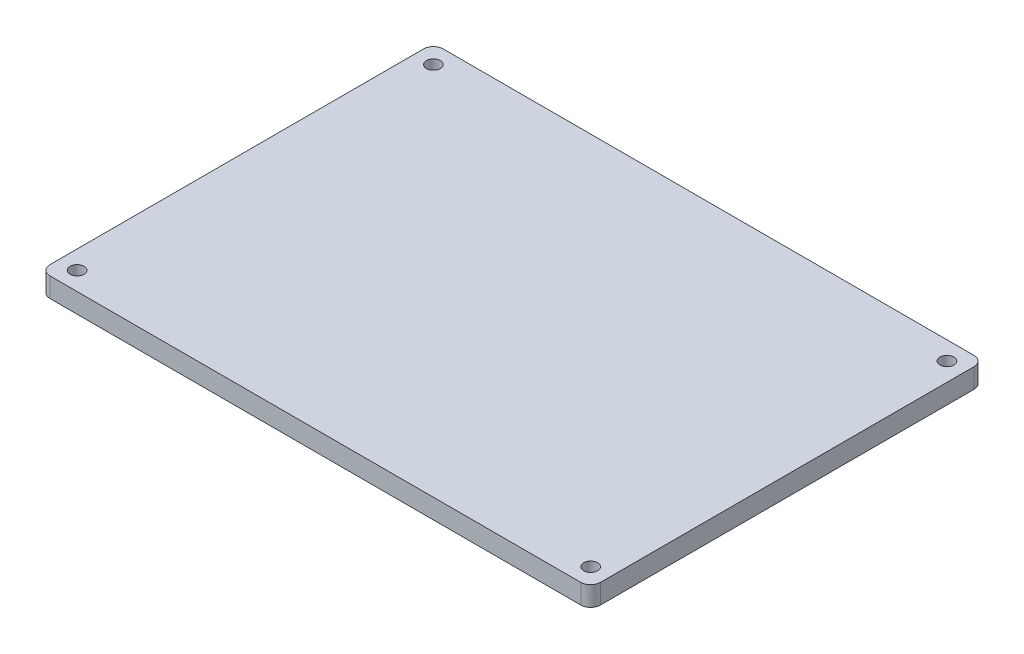
ISO-10303-21;
HEADER;
FILE_DESCRIPTION(('STEP AP214'),'2;1');
FILE_NAME('part.step','',(''),(''),'','','');
FILE_SCHEMA(('AUTOMOTIVE_DESIGN { 1 0 10303 214 1 1 1 1 }'));
ENDSEC;
DATA;
#1=APPLICATION_CONTEXT('core data for automotive mechanical design processes');
#2=APPLICATION_PROTOCOL_DEFINITION('international standard','automotive_design',2000,#1);
#3=PRODUCT_CONTEXT('',#1,'mechanical');
#4=PRODUCT('Part','Part','',(#3));
#5=PRODUCT_RELATED_PRODUCT_CATEGORY('part','',(#4));
#6=PRODUCT_DEFINITION_FORMATION('','',#4);
#7=PRODUCT_DEFINITION_CONTEXT('part definition',#1,'design');
#8=PRODUCT_DEFINITION('design','',#6,#7);
#9=PRODUCT_DEFINITION_SHAPE('','',#8);
#10=(LENGTH_UNIT() NAMED_UNIT(*) SI_UNIT(.MILLI.,.METRE.));
#11=(NAMED_UNIT(*) PLANE_ANGLE_UNIT() SI_UNIT($,.RADIAN.));
#12=(NAMED_UNIT(*) SI_UNIT($,.STERADIAN.) SOLID_ANGLE_UNIT());
#13=UNCERTAINTY_MEASURE_WITH_UNIT(LENGTH_MEASURE(1.E-05),#10,'distance_accuracy_value','');
#14=(GEOMETRIC_REPRESENTATION_CONTEXT(3) GLOBAL_UNCERTAINTY_ASSIGNED_CONTEXT((#13)) GLOBAL_UNIT_ASSIGNED_CONTEXT((#10,
#11,#12)) REPRESENTATION_CONTEXT('',''));
#15=CARTESIAN_POINT('',(0.,0.,0.));
#16=DIRECTION('',(0.,0.,1.));
#17=DIRECTION('',(1.,0.,0.));
#18=AXIS2_PLACEMENT_3D('',#15,#16,#17);
#19=CARTESIAN_POINT('',(-77.1716225130912,664.251916523663,-267.118254717178));
#20=DIRECTION('',(0.,1.,0.));
#21=DIRECTION('',(0.,0.,1.));
#22=AXIS2_PLACEMENT_3D('',#19,#20,#21);
#23=CYLINDRICAL_SURFACE('',#22,3.17499999999999);
#24=CARTESIAN_POINT('',(-77.1716225130912,670.601916523663,-267.118254717178));
#25=DIRECTION('',(0.,-1.,0.));
#26=DIRECTION('',(0.,0.,-1.));
#27=AXIS2_PLACEMENT_3D('',#24,#25,#26);
#28=CIRCLE('',#27,3.17499999999999);
#29=CARTESIAN_POINT('',(-80.3466225130912,670.601916523663,-267.118254717178));
#30=VERTEX_POINT('',#29);
#31=CARTESIAN_POINT('',(-77.1716225130912,670.601916523663,-270.293254717178));
#32=VERTEX_POINT('',#31);
#33=EDGE_CURVE('E131',#30,#32,#28,.T.);
#34=ORIENTED_EDGE('',*,*,#33,.T.);
#35=DIRECTION('',(0.,1.,0.));
#36=VECTOR('',#35,1.);
#37=CARTESIAN_POINT('',(-77.1716225130912,664.251916523663,-270.293254717178));
#38=LINE('',#37,#36);
#39=CARTESIAN_POINT('',(-77.1716225130912,664.251916523663,-270.293254717178));
#40=VERTEX_POINT('',#39);
#41=EDGE_CURVE('E11',#40,#32,#38,.T.);
#42=ORIENTED_EDGE('',*,*,#41,.F.);
#43=CARTESIAN_POINT('',(-77.1716225130912,664.251916523663,-267.118254717178));
#44=DIRECTION('',(0.,-1.,0.));
#45=DIRECTION('',(0.,0.,-1.));
#46=AXIS2_PLACEMENT_3D('',#43,#44,#45);
#47=CIRCLE('',#46,3.17499999999999);
#48=CARTESIAN_POINT('',(-80.3466225130912,664.251916523663,-267.118254717178));
#49=VERTEX_POINT('',#48);
#50=EDGE_CURVE('E146',#49,#40,#47,.T.);
#51=ORIENTED_EDGE('',*,*,#50,.F.);
#52=DIRECTION('',(0.,1.,0.));
#53=VECTOR('',#52,1.);
#54=CARTESIAN_POINT('',(-80.3466225130912,664.251916523663,-267.118254717178));
#55=LINE('',#54,#53);
#56=EDGE_CURVE('E127',#49,#30,#55,.T.);
#57=ORIENTED_EDGE('',*,*,#56,.T.);
#58=EDGE_LOOP('',(#34,#42,#51,#57));
#59=FACE_BOUND('',#58,.T.);
#60=ADVANCED_FACE('F35',(#59),#23,.T.);
#61=CARTESIAN_POINT('',(-77.1716225130912,664.251916523663,-270.293254717178));
#62=DIRECTION('',(0.,0.,1.));
#63=DIRECTION('',(1.,0.,0.));
#64=AXIS2_PLACEMENT_3D('',#61,#62,#63);
#65=PLANE('',#64);
#66=DIRECTION('',(1.,0.,0.));
#67=VECTOR('',#66,1.);
#68=CARTESIAN_POINT('',(-77.1716225130912,670.601916523663,-270.293254717178));
#69=LINE('',#68,#67);
#70=CARTESIAN_POINT('',(94.2783774869087,670.601916523663,-270.293254717178));
#71=VERTEX_POINT('',#70);
#72=EDGE_CURVE('E134',#32,#71,#69,.T.);
#73=ORIENTED_EDGE('',*,*,#72,.T.);
#74=DIRECTION('',(0.,1.,0.));
#75=VECTOR('',#74,1.);
#76=CARTESIAN_POINT('',(94.2783774869087,664.251916523663,-270.293254717178));
#77=LINE('',#76,#75);
#78=CARTESIAN_POINT('',(94.2783774869087,664.251916523663,-270.293254717178));
#79=VERTEX_POINT('',#78);
#80=EDGE_CURVE('E43',#79,#71,#77,.T.);
#81=ORIENTED_EDGE('',*,*,#80,.F.);
#82=DIRECTION('',(1.,0.,0.));
#83=VECTOR('',#82,1.);
#84=CARTESIAN_POINT('',(-77.1716225130912,664.251916523663,-270.293254717178));
#85=LINE('',#84,#83);
#86=EDGE_CURVE('E94',#40,#79,#85,.T.);
#87=ORIENTED_EDGE('',*,*,#86,.F.);
#88=ORIENTED_EDGE('',*,*,#41,.T.);
#89=EDGE_LOOP('',(#73,#81,#87,#88));
#90=FACE_BOUND('',#89,.T.);
#91=ADVANCED_FACE('F244',(#90),#65,.F.);
#92=CARTESIAN_POINT('',(94.2783774869087,664.251916523663,-267.118254717178));
#93=DIRECTION('',(0.,1.,0.));
#94=DIRECTION('',(0.,0.,1.));
#95=AXIS2_PLACEMENT_3D('',#92,#93,#94);
#96=CYLINDRICAL_SURFACE('',#95,3.17499999999999);
#97=CARTESIAN_POINT('',(94.2783774869087,670.601916523663,-267.118254717178));
#98=DIRECTION('',(0.,-1.,0.));
#99=DIRECTION('',(0.,0.,-1.));
#100=AXIS2_PLACEMENT_3D('',#97,#98,#99);
#101=CIRCLE('',#100,3.17499999999999);
#102=CARTESIAN_POINT('',(97.4533774869087,670.601916523663,-267.118254717178));
#103=VERTEX_POINT('',#102);
#104=EDGE_CURVE('E137',#71,#103,#101,.T.);
#105=ORIENTED_EDGE('',*,*,#104,.T.);
#106=DIRECTION('',(0.,1.,0.));
#107=VECTOR('',#106,1.);
#108=CARTESIAN_POINT('',(97.4533774869087,664.251916523663,-267.118254717178));
#109=LINE('',#108,#107);
#110=CARTESIAN_POINT('',(97.4533774869087,664.251916523663,-267.118254717178));
#111=VERTEX_POINT('',#110);
#112=EDGE_CURVE('E153',#111,#103,#109,.T.);
#113=ORIENTED_EDGE('',*,*,#112,.F.);
#114=CARTESIAN_POINT('',(94.2783774869087,664.251916523663,-267.118254717178));
#115=DIRECTION('',(0.,-1.,0.));
#116=DIRECTION('',(0.,0.,-1.));
#117=AXIS2_PLACEMENT_3D('',#114,#115,#116);
#118=CIRCLE('',#117,3.17499999999999);
#119=EDGE_CURVE('E161',#79,#111,#118,.T.);
#120=ORIENTED_EDGE('',*,*,#119,.F.);
#121=ORIENTED_EDGE('',*,*,#80,.T.);
#122=EDGE_LOOP('',(#105,#113,#120,#121));
#123=FACE_BOUND('',#122,.T.);
#124=ADVANCED_FACE('F159',(#123),#96,.T.);
#125=CARTESIAN_POINT('',(97.4533774869087,664.251916523663,-146.468254717179));
#126=DIRECTION('',(-1.,0.,0.));
#127=DIRECTION('',(0.,0.,1.));
#128=AXIS2_PLACEMENT_3D('',#125,#126,#127);
#129=PLANE('',#128);
#130=DIRECTION('',(0.,0.,1.));
#131=VECTOR('',#130,1.);
#132=CARTESIAN_POINT('',(97.4533774869087,670.601916523663,-146.468254717179));
#133=LINE('',#132,#131);
#134=CARTESIAN_POINT('',(97.4533774869087,670.601916523663,-146.468254717179));
#135=VERTEX_POINT('',#134);
#136=EDGE_CURVE('E139',#103,#135,#133,.T.);
#137=ORIENTED_EDGE('',*,*,#136,.T.);
#138=DIRECTION('',(0.,1.,0.));
#139=VECTOR('',#138,1.);
#140=CARTESIAN_POINT('',(97.4533774869087,664.251916523663,-146.468254717179));
#141=LINE('',#140,#139);
#142=CARTESIAN_POINT('',(97.4533774869087,664.251916523663,-146.468254717179));
#143=VERTEX_POINT('',#142);
#144=EDGE_CURVE('E150',#143,#135,#141,.T.);
#145=ORIENTED_EDGE('',*,*,#144,.F.);
#146=DIRECTION('',(0.,0.,1.));
#147=VECTOR('',#146,1.);
#148=CARTESIAN_POINT('',(97.4533774869087,664.251916523663,-146.468254717179));
#149=LINE('',#148,#147);
#150=EDGE_CURVE('E173',#111,#143,#149,.T.);
#151=ORIENTED_EDGE('',*,*,#150,.F.);
#152=ORIENTED_EDGE('',*,*,#112,.T.);
#153=EDGE_LOOP('',(#137,#145,#151,#152));
#154=FACE_BOUND('',#153,.T.);
#155=ADVANCED_FACE('F169',(#154),#129,.F.);
#156=CARTESIAN_POINT('',(94.2783774869087,664.251916523663,-146.468254717179));
#157=DIRECTION('',(0.,1.,0.));
#158=DIRECTION('',(0.,0.,1.));
#159=AXIS2_PLACEMENT_3D('',#156,#157,#158);
#160=CYLINDRICAL_SURFACE('',#159,3.175);
#161=CARTESIAN_POINT('',(94.2783774869087,670.601916523663,-146.468254717179));
#162=DIRECTION('',(0.,-1.,0.));
#163=DIRECTION('',(0.,0.,1.));
#164=AXIS2_PLACEMENT_3D('',#161,#162,#163);
#165=CIRCLE('',#164,3.175);
#166=CARTESIAN_POINT('',(94.2783774869087,670.601916523663,-143.293254717179));
#167=VERTEX_POINT('',#166);
#168=EDGE_CURVE('E141',#135,#167,#165,.T.);
#169=ORIENTED_EDGE('',*,*,#168,.T.);
#170=DIRECTION('',(0.,1.,0.));
#171=VECTOR('',#170,1.);
#172=CARTESIAN_POINT('',(94.2783774869087,664.251916523663,-143.293254717179));
#173=LINE('',#172,#171);
#174=CARTESIAN_POINT('',(94.2783774869087,664.251916523663,-143.293254717179));
#175=VERTEX_POINT('',#174);
#176=EDGE_CURVE('E122',#175,#167,#173,.T.);
#177=ORIENTED_EDGE('',*,*,#176,.F.);
#178=CARTESIAN_POINT('',(94.2783774869087,664.251916523663,-146.468254717179));
#179=DIRECTION('',(0.,-1.,0.));
#180=DIRECTION('',(0.,0.,1.));
#181=AXIS2_PLACEMENT_3D('',#178,#179,#180);
#182=CIRCLE('',#181,3.175);
#183=EDGE_CURVE('E113',#143,#175,#182,.T.);
#184=ORIENTED_EDGE('',*,*,#183,.F.);
#185=ORIENTED_EDGE('',*,*,#144,.T.);
#186=EDGE_LOOP('',(#169,#177,#184,#185));
#187=FACE_BOUND('',#186,.T.);
#188=ADVANCED_FACE('F172',(#187),#160,.T.);
#189=CARTESIAN_POINT('',(-77.1716225130912,664.251916523663,-143.293254717179));
#190=DIRECTION('',(0.,0.,-1.));
#191=DIRECTION('',(-1.,0.,0.));
#192=AXIS2_PLACEMENT_3D('',#189,#190,#191);
#193=PLANE('',#192);
#194=DIRECTION('',(-1.,0.,0.));
#195=VECTOR('',#194,1.);
#196=CARTESIAN_POINT('',(-77.1716225130912,670.601916523663,-143.293254717179));
#197=LINE('',#196,#195);
#198=CARTESIAN_POINT('',(-77.1716225130912,670.601916523663,-143.293254717179));
#199=VERTEX_POINT('',#198);
#200=EDGE_CURVE('E121',#167,#199,#197,.T.);
#201=ORIENTED_EDGE('',*,*,#200,.T.);
#202=DIRECTION('',(0.,1.,0.));
#203=VECTOR('',#202,1.);
#204=CARTESIAN_POINT('',(-77.1716225130912,664.251916523663,-143.293254717179));
#205=LINE('',#204,#203);
#206=CARTESIAN_POINT('',(-77.1716225130912,664.251916523663,-143.293254717179));
#207=VERTEX_POINT('',#206);
#208=EDGE_CURVE('E118',#207,#199,#205,.T.);
#209=ORIENTED_EDGE('',*,*,#208,.F.);
#210=DIRECTION('',(-1.,0.,0.));
#211=VECTOR('',#210,1.);
#212=CARTESIAN_POINT('',(-77.1716225130912,664.251916523663,-143.293254717179));
#213=LINE('',#212,#211);
#214=EDGE_CURVE('E107',#175,#207,#213,.T.);
#215=ORIENTED_EDGE('',*,*,#214,.F.);
#216=ORIENTED_EDGE('',*,*,#176,.T.);
#217=EDGE_LOOP('',(#201,#209,#215,#216));
#218=FACE_BOUND('',#217,.T.);
#219=ADVANCED_FACE('F119',(#218),#193,.F.);
#220=CARTESIAN_POINT('',(-77.1716225130912,664.251916523663,-146.468254717179));
#221=DIRECTION('',(0.,1.,0.));
#222=DIRECTION('',(0.,0.,1.));
#223=AXIS2_PLACEMENT_3D('',#220,#221,#222);
#224=CYLINDRICAL_SURFACE('',#223,3.175);
#225=CARTESIAN_POINT('',(-77.1716225130912,670.601916523663,-146.468254717179));
#226=DIRECTION('',(0.,-1.,0.));
#227=DIRECTION('',(0.,0.,-1.));
#228=AXIS2_PLACEMENT_3D('',#225,#226,#227);
#229=CIRCLE('',#228,3.175);
#230=CARTESIAN_POINT('',(-80.3466225130912,670.601916523663,-146.468254717179));
#231=VERTEX_POINT('',#230);
#232=EDGE_CURVE('E80',#199,#231,#229,.T.);
#233=ORIENTED_EDGE('',*,*,#232,.T.);
#234=DIRECTION('',(0.,1.,0.));
#235=VECTOR('',#234,1.);
#236=CARTESIAN_POINT('',(-80.3466225130912,664.251916523663,-146.468254717179));
#237=LINE('',#236,#235);
#238=CARTESIAN_POINT('',(-80.3466225130912,664.251916523663,-146.468254717179));
#239=VERTEX_POINT('',#238);
#240=EDGE_CURVE('E123',#239,#231,#237,.T.);
#241=ORIENTED_EDGE('',*,*,#240,.F.);
#242=CARTESIAN_POINT('',(-77.1716225130912,664.251916523663,-146.468254717179));
#243=DIRECTION('',(0.,-1.,0.));
#244=DIRECTION('',(0.,0.,-1.));
#245=AXIS2_PLACEMENT_3D('',#242,#243,#244);
#246=CIRCLE('',#245,3.175);
#247=EDGE_CURVE('E111',#207,#239,#246,.T.);
#248=ORIENTED_EDGE('',*,*,#247,.F.);
#249=ORIENTED_EDGE('',*,*,#208,.T.);
#250=EDGE_LOOP('',(#233,#241,#248,#249));
#251=FACE_BOUND('',#250,.T.);
#252=ADVANCED_FACE('F125',(#251),#224,.T.);
#253=CARTESIAN_POINT('',(-80.3466225130912,664.251916523663,-146.468254717179));
#254=DIRECTION('',(1.,0.,0.));
#255=DIRECTION('',(0.,0.,-1.));
#256=AXIS2_PLACEMENT_3D('',#253,#254,#255);
#257=PLANE('',#256);
#258=DIRECTION('',(0.,0.,-1.));
#259=VECTOR('',#258,1.);
#260=CARTESIAN_POINT('',(-80.3466225130912,670.601916523663,-146.468254717179));
#261=LINE('',#260,#259);
#262=EDGE_CURVE('E86',#231,#30,#261,.T.);
#263=ORIENTED_EDGE('',*,*,#262,.T.);
#264=ORIENTED_EDGE('',*,*,#56,.F.);
#265=DIRECTION('',(0.,0.,-1.));
#266=VECTOR('',#265,1.);
#267=CARTESIAN_POINT('',(-80.3466225130912,664.251916523663,-146.468254717179));
#268=LINE('',#267,#266);
#269=EDGE_CURVE('E51',#239,#49,#268,.T.);
#270=ORIENTED_EDGE('',*,*,#269,.F.);
#271=ORIENTED_EDGE('',*,*,#240,.T.);
#272=EDGE_LOOP('',(#263,#264,#270,#271));
#273=FACE_BOUND('',#272,.T.);
#274=ADVANCED_FACE('F219',(#273),#257,.F.);
#275=CARTESIAN_POINT('',(-77.1716225130912,664.251916523663,-267.118254717178));
#276=DIRECTION('',(0.,-1.,0.));
#277=DIRECTION('',(0.,0.,-1.));
#278=AXIS2_PLACEMENT_3D('',#275,#276,#277);
#279=PLANE('',#278);
#280=CARTESIAN_POINT('',(91.5002524869087,664.251916523663,-149.246379717179));
#281=DIRECTION('',(0.,-1.,0.));
#282=DIRECTION('',(0.,0.,-1.));
#283=AXIS2_PLACEMENT_3D('',#280,#281,#282);
#284=CIRCLE('',#283,4.7);
#285=CARTESIAN_POINT('',(91.5002524869087,664.251916523663,-153.946379717179));
#286=VERTEX_POINT('',#285);
#287=EDGE_CURVE('E211',#286,#286,#284,.T.);
#288=ORIENTED_EDGE('',*,*,#287,.F.);
#289=EDGE_LOOP('',(#288));
#290=FACE_BOUND('',#289,.T.);
#291=CARTESIAN_POINT('',(91.5002524869087,664.251916523663,-264.340129717179));
#292=DIRECTION('',(0.,-1.,0.));
#293=DIRECTION('',(0.,0.,-1.));
#294=AXIS2_PLACEMENT_3D('',#291,#292,#293);
#295=CIRCLE('',#294,4.7);
#296=CARTESIAN_POINT('',(91.5002524869087,664.251916523663,-269.040129717179));
#297=VERTEX_POINT('',#296);
#298=EDGE_CURVE('E202',#297,#297,#295,.T.);
#299=ORIENTED_EDGE('',*,*,#298,.F.);
#300=EDGE_LOOP('',(#299));
#301=FACE_BOUND('',#300,.T.);
#302=CARTESIAN_POINT('',(-74.3934975130911,664.251916523663,-264.340129717179));
#303=DIRECTION('',(0.,-1.,0.));
#304=DIRECTION('',(0.,0.,-1.));
#305=AXIS2_PLACEMENT_3D('',#302,#303,#304);
#306=CIRCLE('',#305,4.7);
#307=CARTESIAN_POINT('',(-74.3934975130911,664.251916523663,-269.040129717179));
#308=VERTEX_POINT('',#307);
#309=EDGE_CURVE('E193',#308,#308,#306,.T.);
#310=ORIENTED_EDGE('',*,*,#309,.F.);
#311=EDGE_LOOP('',(#310));
#312=FACE_BOUND('',#311,.T.);
#313=CARTESIAN_POINT('',(-74.3934975130913,664.251916523663,-149.246379717179));
#314=DIRECTION('',(0.,-1.,0.));
#315=DIRECTION('',(0.,0.,-1.));
#316=AXIS2_PLACEMENT_3D('',#313,#314,#315);
#317=CIRCLE('',#316,4.7);
#318=CARTESIAN_POINT('',(-74.3934975130913,664.251916523663,-153.946379717179));
#319=VERTEX_POINT('',#318);
#320=EDGE_CURVE('E184',#319,#319,#317,.T.);
#321=ORIENTED_EDGE('',*,*,#320,.F.);
#322=EDGE_LOOP('',(#321));
#323=FACE_BOUND('',#322,.T.);
#324=ORIENTED_EDGE('',*,*,#50,.T.);
#325=ORIENTED_EDGE('',*,*,#86,.T.);
#326=ORIENTED_EDGE('',*,*,#119,.T.);
#327=ORIENTED_EDGE('',*,*,#150,.T.);
#328=ORIENTED_EDGE('',*,*,#183,.T.);
#329=ORIENTED_EDGE('',*,*,#214,.T.);
#330=ORIENTED_EDGE('',*,*,#247,.T.);
#331=ORIENTED_EDGE('',*,*,#269,.T.);
#332=EDGE_LOOP('',(#324,#325,#326,#327,#328,#329,#330,#331));
#333=FACE_BOUND('',#332,.T.);
#334=ADVANCED_FACE('F109',(#290,#301,#312,#323,#333),#279,.T.);
#335=CARTESIAN_POINT('',(-77.1716225130912,670.601916523663,-267.118254717178));
#336=DIRECTION('',(0.,-1.,0.));
#337=DIRECTION('',(0.,0.,-1.));
#338=AXIS2_PLACEMENT_3D('',#335,#336,#337);
#339=PLANE('',#338);
#340=CARTESIAN_POINT('',(91.5002524869087,670.601916523663,-149.246379717179));
#341=DIRECTION('',(0.,-1.,0.));
#342=DIRECTION('',(0.,0.,-1.));
#343=AXIS2_PLACEMENT_3D('',#340,#341,#342);
#344=CIRCLE('',#343,2.24999999999999);
#345=CARTESIAN_POINT('',(91.5002524869087,670.601916523663,-151.496379717179));
#346=VERTEX_POINT('',#345);
#347=EDGE_CURVE('E205',#346,#346,#344,.T.);
#348=ORIENTED_EDGE('',*,*,#347,.T.);
#349=EDGE_LOOP('',(#348));
#350=FACE_BOUND('',#349,.T.);
#351=CARTESIAN_POINT('',(91.5002524869087,670.601916523663,-264.340129717179));
#352=DIRECTION('',(0.,-1.,0.));
#353=DIRECTION('',(0.,0.,-1.));
#354=AXIS2_PLACEMENT_3D('',#351,#352,#353);
#355=CIRCLE('',#354,2.24999999999999);
#356=CARTESIAN_POINT('',(91.5002524869087,670.601916523663,-266.590129717179));
#357=VERTEX_POINT('',#356);
#358=EDGE_CURVE('E196',#357,#357,#355,.T.);
#359=ORIENTED_EDGE('',*,*,#358,.T.);
#360=EDGE_LOOP('',(#359));
#361=FACE_BOUND('',#360,.T.);
#362=CARTESIAN_POINT('',(-74.3934975130911,670.601916523663,-264.340129717179));
#363=DIRECTION('',(0.,-1.,0.));
#364=DIRECTION('',(0.,0.,-1.));
#365=AXIS2_PLACEMENT_3D('',#362,#363,#364);
#366=CIRCLE('',#365,2.24999999999999);
#367=CARTESIAN_POINT('',(-74.3934975130911,670.601916523663,-266.590129717179));
#368=VERTEX_POINT('',#367);
#369=EDGE_CURVE('E187',#368,#368,#366,.T.);
#370=ORIENTED_EDGE('',*,*,#369,.T.);
#371=EDGE_LOOP('',(#370));
#372=FACE_BOUND('',#371,.T.);
#373=CARTESIAN_POINT('',(-74.3934975130913,670.601916523663,-149.246379717179));
#374=DIRECTION('',(0.,-1.,0.));
#375=DIRECTION('',(0.,0.,-1.));
#376=AXIS2_PLACEMENT_3D('',#373,#374,#375);
#377=CIRCLE('',#376,2.24999999999999);
#378=CARTESIAN_POINT('',(-74.3934975130913,670.601916523663,-151.496379717179));
#379=VERTEX_POINT('',#378);
#380=EDGE_CURVE('E135',#379,#379,#377,.T.);
#381=ORIENTED_EDGE('',*,*,#380,.T.);
#382=EDGE_LOOP('',(#381));
#383=FACE_BOUND('',#382,.T.);
#384=ORIENTED_EDGE('',*,*,#33,.F.);
#385=ORIENTED_EDGE('',*,*,#262,.F.);
#386=ORIENTED_EDGE('',*,*,#232,.F.);
#387=ORIENTED_EDGE('',*,*,#200,.F.);
#388=ORIENTED_EDGE('',*,*,#168,.F.);
#389=ORIENTED_EDGE('',*,*,#136,.F.);
#390=ORIENTED_EDGE('',*,*,#104,.F.);
#391=ORIENTED_EDGE('',*,*,#72,.F.);
#392=EDGE_LOOP('',(#384,#385,#386,#387,#388,#389,#390,#391));
#393=FACE_BOUND('',#392,.T.);
#394=ADVANCED_FACE('F165',(#350,#361,#372,#383,#393),#339,.F.);
#395=CARTESIAN_POINT('',(-74.3934975130913,664.251916523663,-149.246379717179));
#396=DIRECTION('',(0.,-1.,0.));
#397=DIRECTION('',(0.,0.,-1.));
#398=AXIS2_PLACEMENT_3D('',#395,#396,#397);
#399=CYLINDRICAL_SURFACE('',#398,2.24999999999999);
#400=ORIENTED_EDGE('',*,*,#380,.F.);
#401=EDGE_LOOP('',(#400));
#402=FACE_BOUND('',#401,.T.);
#403=CARTESIAN_POINT('',(-74.3934975130913,666.701916523663,-149.246379717179));
#404=DIRECTION('',(0.,-1.,0.));
#405=DIRECTION('',(0.,0.,-1.));
#406=AXIS2_PLACEMENT_3D('',#403,#404,#405);
#407=CIRCLE('',#406,2.24999999999999);
#408=CARTESIAN_POINT('',(-74.3934975130913,666.701916523663,-151.496379717179));
#409=VERTEX_POINT('',#408);
#410=EDGE_CURVE('E181',#409,#409,#407,.T.);
#411=ORIENTED_EDGE('',*,*,#410,.T.);
#412=EDGE_LOOP('',(#411));
#413=FACE_BOUND('',#412,.T.);
#414=ADVANCED_FACE('F230',(#402,#413),#399,.F.);
#415=CARTESIAN_POINT('',(-74.3934975130913,664.251916523663,-149.246379717179));
#416=DIRECTION('',(0.,-1.,0.));
#417=DIRECTION('',(0.,0.,-1.));
#418=AXIS2_PLACEMENT_3D('',#415,#416,#417);
#419=CONICAL_SURFACE('',#418,4.7,0.78539816339746);
#420=ORIENTED_EDGE('',*,*,#410,.F.);
#421=EDGE_LOOP('',(#420));
#422=FACE_BOUND('',#421,.T.);
#423=ORIENTED_EDGE('',*,*,#320,.T.);
#424=EDGE_LOOP('',(#423));
#425=FACE_BOUND('',#424,.T.);
#426=ADVANCED_FACE('F227',(#422,#425),#419,.F.);
#427=CARTESIAN_POINT('',(-74.3934975130911,664.251916523663,-264.340129717179));
#428=DIRECTION('',(0.,-1.,0.));
#429=DIRECTION('',(0.,0.,-1.));
#430=AXIS2_PLACEMENT_3D('',#427,#428,#429);
#431=CYLINDRICAL_SURFACE('',#430,2.24999999999999);
#432=ORIENTED_EDGE('',*,*,#369,.F.);
#433=EDGE_LOOP('',(#432));
#434=FACE_BOUND('',#433,.T.);
#435=CARTESIAN_POINT('',(-74.3934975130911,666.701916523663,-264.340129717179));
#436=DIRECTION('',(0.,-1.,0.));
#437=DIRECTION('',(0.,0.,-1.));
#438=AXIS2_PLACEMENT_3D('',#435,#436,#437);
#439=CIRCLE('',#438,2.24999999999999);
#440=CARTESIAN_POINT('',(-74.3934975130911,666.701916523663,-266.590129717179));
#441=VERTEX_POINT('',#440);
#442=EDGE_CURVE('E190',#441,#441,#439,.T.);
#443=ORIENTED_EDGE('',*,*,#442,.T.);
#444=EDGE_LOOP('',(#443));
#445=FACE_BOUND('',#444,.T.);
#446=ADVANCED_FACE('F229',(#434,#445),#431,.F.);
#447=CARTESIAN_POINT('',(-74.3934975130911,664.251916523663,-264.340129717179));
#448=DIRECTION('',(0.,-1.,0.));
#449=DIRECTION('',(0.,0.,-1.));
#450=AXIS2_PLACEMENT_3D('',#447,#448,#449);
#451=CONICAL_SURFACE('',#450,4.7,0.78539816339746);
#452=ORIENTED_EDGE('',*,*,#442,.F.);
#453=EDGE_LOOP('',(#452));
#454=FACE_BOUND('',#453,.T.);
#455=ORIENTED_EDGE('',*,*,#309,.T.);
#456=EDGE_LOOP('',(#455));
#457=FACE_BOUND('',#456,.T.);
#458=ADVANCED_FACE('F237',(#454,#457),#451,.F.);
#459=CARTESIAN_POINT('',(91.5002524869087,664.251916523663,-264.340129717179));
#460=DIRECTION('',(0.,-1.,0.));
#461=DIRECTION('',(0.,0.,-1.));
#462=AXIS2_PLACEMENT_3D('',#459,#460,#461);
#463=CYLINDRICAL_SURFACE('',#462,2.24999999999999);
#464=ORIENTED_EDGE('',*,*,#358,.F.);
#465=EDGE_LOOP('',(#464));
#466=FACE_BOUND('',#465,.T.);
#467=CARTESIAN_POINT('',(91.5002524869087,666.701916523663,-264.340129717179));
#468=DIRECTION('',(0.,-1.,0.));
#469=DIRECTION('',(0.,0.,-1.));
#470=AXIS2_PLACEMENT_3D('',#467,#468,#469);
#471=CIRCLE('',#470,2.24999999999999);
#472=CARTESIAN_POINT('',(91.5002524869087,666.701916523663,-266.590129717179));
#473=VERTEX_POINT('',#472);
#474=EDGE_CURVE('E199',#473,#473,#471,.T.);
#475=ORIENTED_EDGE('',*,*,#474,.T.);
#476=EDGE_LOOP('',(#475));
#477=FACE_BOUND('',#476,.T.);
#478=ADVANCED_FACE('F329',(#466,#477),#463,.F.);
#479=CARTESIAN_POINT('',(91.5002524869087,664.251916523663,-264.340129717179));
#480=DIRECTION('',(0.,-1.,0.));
#481=DIRECTION('',(0.,0.,-1.));
#482=AXIS2_PLACEMENT_3D('',#479,#480,#481);
#483=CONICAL_SURFACE('',#482,4.7,0.78539816339746);
#484=ORIENTED_EDGE('',*,*,#474,.F.);
#485=EDGE_LOOP('',(#484));
#486=FACE_BOUND('',#485,.T.);
#487=ORIENTED_EDGE('',*,*,#298,.T.);
#488=EDGE_LOOP('',(#487));
#489=FACE_BOUND('',#488,.T.);
#490=ADVANCED_FACE('F339',(#486,#489),#483,.F.);
#491=CARTESIAN_POINT('',(91.5002524869087,664.251916523663,-149.246379717179));
#492=DIRECTION('',(0.,-1.,0.));
#493=DIRECTION('',(0.,0.,-1.));
#494=AXIS2_PLACEMENT_3D('',#491,#492,#493);
#495=CYLINDRICAL_SURFACE('',#494,2.24999999999999);
#496=ORIENTED_EDGE('',*,*,#347,.F.);
#497=EDGE_LOOP('',(#496));
#498=FACE_BOUND('',#497,.T.);
#499=CARTESIAN_POINT('',(91.5002524869087,666.701916523663,-149.246379717179));
#500=DIRECTION('',(0.,-1.,0.));
#501=DIRECTION('',(0.,0.,-1.));
#502=AXIS2_PLACEMENT_3D('',#499,#500,#501);
#503=CIRCLE('',#502,2.24999999999999);
#504=CARTESIAN_POINT('',(91.5002524869087,666.701916523663,-151.496379717179));
#505=VERTEX_POINT('',#504);
#506=EDGE_CURVE('E208',#505,#505,#503,.T.);
#507=ORIENTED_EDGE('',*,*,#506,.T.);
#508=EDGE_LOOP('',(#507));
#509=FACE_BOUND('',#508,.T.);
#510=ADVANCED_FACE('F349',(#498,#509),#495,.F.);
#511=CARTESIAN_POINT('',(91.5002524869087,664.251916523663,-149.246379717179));
#512=DIRECTION('',(0.,-1.,0.));
#513=DIRECTION('',(0.,0.,-1.));
#514=AXIS2_PLACEMENT_3D('',#511,#512,#513);
#515=CONICAL_SURFACE('',#514,4.7,0.78539816339746);
#516=ORIENTED_EDGE('',*,*,#506,.F.);
#517=EDGE_LOOP('',(#516));
#518=FACE_BOUND('',#517,.T.);
#519=ORIENTED_EDGE('',*,*,#287,.T.);
#520=EDGE_LOOP('',(#519));
#521=FACE_BOUND('',#520,.T.);
#522=ADVANCED_FACE('F215',(#518,#521),#515,.F.);
#523=CLOSED_SHELL('',(#60,#91,#124,#155,#188,#219,#252,#274,#334,#394,#414,#426,#446,#458,#478,
#490,#510,#522));
#524=MANIFOLD_SOLID_BREP('B2',#523);
#525=ADVANCED_BREP_SHAPE_REPRESENTATION('',(#18,#524),#14);
#526=SHAPE_DEFINITION_REPRESENTATION(#9,#525);
ENDSEC;
END-ISO-10303-21;
